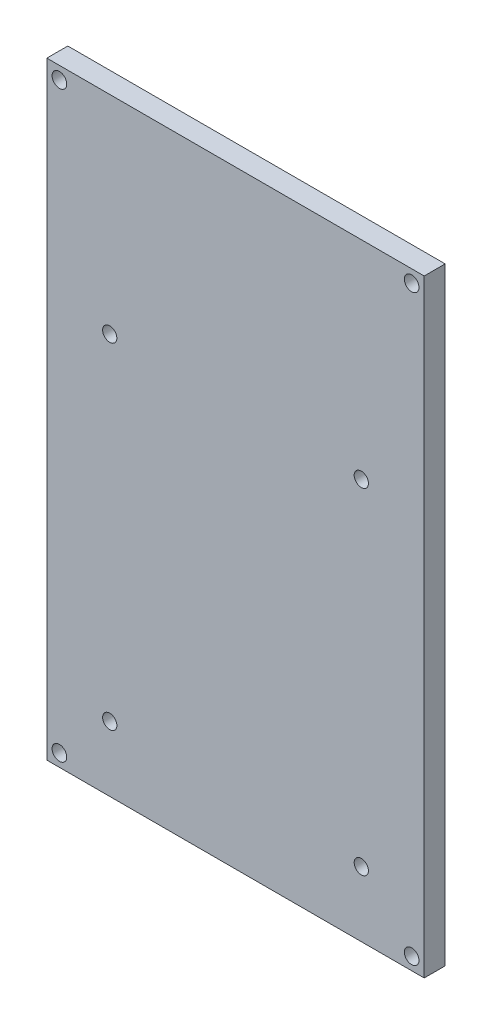
ISO-10303-21;
HEADER;
FILE_DESCRIPTION(('STEP AP214'),'2;1');
FILE_NAME('part.step','',(''),(''),'','','');
FILE_SCHEMA(('AUTOMOTIVE_DESIGN { 1 0 10303 214 1 1 1 1 }'));
ENDSEC;
DATA;
#1=APPLICATION_CONTEXT('core data for automotive mechanical design processes');
#2=APPLICATION_PROTOCOL_DEFINITION('international standard','automotive_design',2000,#1);
#3=PRODUCT_CONTEXT('',#1,'mechanical');
#4=PRODUCT('Part','Part','',(#3));
#5=PRODUCT_RELATED_PRODUCT_CATEGORY('part','',(#4));
#6=PRODUCT_DEFINITION_FORMATION('','',#4);
#7=PRODUCT_DEFINITION_CONTEXT('part definition',#1,'design');
#8=PRODUCT_DEFINITION('design','',#6,#7);
#9=PRODUCT_DEFINITION_SHAPE('','',#8);
#10=(LENGTH_UNIT() NAMED_UNIT(*) SI_UNIT(.MILLI.,.METRE.));
#11=(NAMED_UNIT(*) PLANE_ANGLE_UNIT() SI_UNIT($,.RADIAN.));
#12=(NAMED_UNIT(*) SI_UNIT($,.STERADIAN.) SOLID_ANGLE_UNIT());
#13=UNCERTAINTY_MEASURE_WITH_UNIT(LENGTH_MEASURE(1.E-05),#10,'distance_accuracy_value','');
#14=(GEOMETRIC_REPRESENTATION_CONTEXT(3) GLOBAL_UNCERTAINTY_ASSIGNED_CONTEXT((#13)) GLOBAL_UNIT_ASSIGNED_CONTEXT((#10,
#11,#12)) REPRESENTATION_CONTEXT('',''));
#15=CARTESIAN_POINT('',(0.,0.,0.));
#16=DIRECTION('',(0.,0.,1.));
#17=DIRECTION('',(1.,0.,0.));
#18=AXIS2_PLACEMENT_3D('',#15,#16,#17);
#19=CARTESIAN_POINT('',(45.,-72.5,5.));
#20=DIRECTION('',(-1.,0.,0.));
#21=DIRECTION('',(0.,0.,1.));
#22=AXIS2_PLACEMENT_3D('',#19,#20,#21);
#23=PLANE('',#22);
#24=DIRECTION('',(0.,1.,0.));
#25=VECTOR('',#24,1.);
#26=CARTESIAN_POINT('',(45.,-72.5,0.));
#27=LINE('',#26,#25);
#28=CARTESIAN_POINT('',(45.,-72.5,0.));
#29=VERTEX_POINT('',#28);
#30=CARTESIAN_POINT('',(45.,72.5,0.));
#31=VERTEX_POINT('',#30);
#32=EDGE_CURVE('E106',#29,#31,#27,.T.);
#33=ORIENTED_EDGE('',*,*,#32,.T.);
#34=DIRECTION('',(0.,0.,-1.));
#35=VECTOR('',#34,1.);
#36=CARTESIAN_POINT('',(45.,72.5,5.));
#37=LINE('',#36,#35);
#38=CARTESIAN_POINT('',(45.,72.5,5.));
#39=VERTEX_POINT('',#38);
#40=EDGE_CURVE('E11',#39,#31,#37,.T.);
#41=ORIENTED_EDGE('',*,*,#40,.F.);
#42=DIRECTION('',(0.,1.,0.));
#43=VECTOR('',#42,1.);
#44=CARTESIAN_POINT('',(45.,-72.5,5.));
#45=LINE('',#44,#43);
#46=CARTESIAN_POINT('',(45.,-72.5,5.));
#47=VERTEX_POINT('',#46);
#48=EDGE_CURVE('E90',#47,#39,#45,.T.);
#49=ORIENTED_EDGE('',*,*,#48,.F.);
#50=DIRECTION('',(0.,0.,-1.));
#51=VECTOR('',#50,1.);
#52=CARTESIAN_POINT('',(45.,-72.5,5.));
#53=LINE('',#52,#51);
#54=EDGE_CURVE('E102',#47,#29,#53,.T.);
#55=ORIENTED_EDGE('',*,*,#54,.T.);
#56=EDGE_LOOP('',(#33,#41,#49,#55));
#57=FACE_BOUND('',#56,.T.);
#58=ADVANCED_FACE('F38',(#57),#23,.F.);
#59=CARTESIAN_POINT('',(-45.,72.5,5.));
#60=DIRECTION('',(0.,-1.,0.));
#61=DIRECTION('',(0.,0.,-1.));
#62=AXIS2_PLACEMENT_3D('',#59,#60,#61);
#63=PLANE('',#62);
#64=DIRECTION('',(-1.,0.,0.));
#65=VECTOR('',#64,1.);
#66=CARTESIAN_POINT('',(-45.,72.5,0.));
#67=LINE('',#66,#65);
#68=CARTESIAN_POINT('',(-45.,72.5,0.));
#69=VERTEX_POINT('',#68);
#70=EDGE_CURVE('E95',#31,#69,#67,.T.);
#71=ORIENTED_EDGE('',*,*,#70,.T.);
#72=DIRECTION('',(0.,0.,-1.));
#73=VECTOR('',#72,1.);
#74=CARTESIAN_POINT('',(-45.,72.5,5.));
#75=LINE('',#74,#73);
#76=CARTESIAN_POINT('',(-45.,72.5,5.));
#77=VERTEX_POINT('',#76);
#78=EDGE_CURVE('E47',#77,#69,#75,.T.);
#79=ORIENTED_EDGE('',*,*,#78,.F.);
#80=DIRECTION('',(-1.,0.,0.));
#81=VECTOR('',#80,1.);
#82=CARTESIAN_POINT('',(-45.,72.5,5.));
#83=LINE('',#82,#81);
#84=EDGE_CURVE('E85',#39,#77,#83,.T.);
#85=ORIENTED_EDGE('',*,*,#84,.F.);
#86=ORIENTED_EDGE('',*,*,#40,.T.);
#87=EDGE_LOOP('',(#71,#79,#85,#86));
#88=FACE_BOUND('',#87,.T.);
#89=ADVANCED_FACE('F94',(#88),#63,.F.);
#90=CARTESIAN_POINT('',(-45.,-72.5,5.));
#91=DIRECTION('',(1.,0.,0.));
#92=DIRECTION('',(0.,0.,-1.));
#93=AXIS2_PLACEMENT_3D('',#90,#91,#92);
#94=PLANE('',#93);
#95=DIRECTION('',(0.,-1.,0.));
#96=VECTOR('',#95,1.);
#97=CARTESIAN_POINT('',(-45.,-72.5,0.));
#98=LINE('',#97,#96);
#99=CARTESIAN_POINT('',(-45.,-72.5,0.));
#100=VERTEX_POINT('',#99);
#101=EDGE_CURVE('E72',#69,#100,#98,.T.);
#102=ORIENTED_EDGE('',*,*,#101,.T.);
#103=DIRECTION('',(0.,0.,-1.));
#104=VECTOR('',#103,1.);
#105=CARTESIAN_POINT('',(-45.,-72.5,5.));
#106=LINE('',#105,#104);
#107=CARTESIAN_POINT('',(-45.,-72.5,5.));
#108=VERTEX_POINT('',#107);
#109=EDGE_CURVE('E97',#108,#100,#106,.T.);
#110=ORIENTED_EDGE('',*,*,#109,.F.);
#111=DIRECTION('',(0.,-1.,0.));
#112=VECTOR('',#111,1.);
#113=CARTESIAN_POINT('',(-45.,-72.5,5.));
#114=LINE('',#113,#112);
#115=EDGE_CURVE('E88',#77,#108,#114,.T.);
#116=ORIENTED_EDGE('',*,*,#115,.F.);
#117=ORIENTED_EDGE('',*,*,#78,.T.);
#118=EDGE_LOOP('',(#102,#110,#116,#117));
#119=FACE_BOUND('',#118,.T.);
#120=ADVANCED_FACE('F98',(#119),#94,.F.);
#121=CARTESIAN_POINT('',(-45.,-72.5,5.));
#122=DIRECTION('',(0.,1.,0.));
#123=DIRECTION('',(0.,0.,1.));
#124=AXIS2_PLACEMENT_3D('',#121,#122,#123);
#125=PLANE('',#124);
#126=DIRECTION('',(1.,0.,0.));
#127=VECTOR('',#126,1.);
#128=CARTESIAN_POINT('',(-45.,-72.5,0.));
#129=LINE('',#128,#127);
#130=EDGE_CURVE('E78',#100,#29,#129,.T.);
#131=ORIENTED_EDGE('',*,*,#130,.T.);
#132=ORIENTED_EDGE('',*,*,#54,.F.);
#133=DIRECTION('',(1.,0.,0.));
#134=VECTOR('',#133,1.);
#135=CARTESIAN_POINT('',(-45.,-72.5,5.));
#136=LINE('',#135,#134);
#137=EDGE_CURVE('E55',#108,#47,#136,.T.);
#138=ORIENTED_EDGE('',*,*,#137,.F.);
#139=ORIENTED_EDGE('',*,*,#109,.T.);
#140=EDGE_LOOP('',(#131,#132,#138,#139));
#141=FACE_BOUND('',#140,.T.);
#142=ADVANCED_FACE('F120',(#141),#125,.F.);
#143=CARTESIAN_POINT('',(0.,0.,5.));
#144=DIRECTION('',(0.,0.,-1.));
#145=DIRECTION('',(-1.,0.,0.));
#146=AXIS2_PLACEMENT_3D('',#143,#144,#145);
#147=PLANE('',#146);
#148=CARTESIAN_POINT('',(30.0000000000001,-56.9999999999999,5.));
#149=DIRECTION('',(0.,0.,-1.));
#150=DIRECTION('',(1.,0.,0.));
#151=AXIS2_PLACEMENT_3D('',#148,#149,#150);
#152=CIRCLE('',#151,1.7);
#153=CARTESIAN_POINT('',(31.7000000000001,-56.9999999999999,5.));
#154=VERTEX_POINT('',#153);
#155=EDGE_CURVE('E171',#154,#154,#152,.T.);
#156=ORIENTED_EDGE('',*,*,#155,.T.);
#157=EDGE_LOOP('',(#156));
#158=FACE_BOUND('',#157,.T.);
#159=CARTESIAN_POINT('',(-29.9999999999999,-57.,5.));
#160=DIRECTION('',(0.,0.,-1.));
#161=DIRECTION('',(-1.,0.,0.));
#162=AXIS2_PLACEMENT_3D('',#159,#160,#161);
#163=CIRCLE('',#162,1.7);
#164=CARTESIAN_POINT('',(-31.6999999999999,-57.,5.));
#165=VERTEX_POINT('',#164);
#166=EDGE_CURVE('E179',#165,#165,#163,.T.);
#167=ORIENTED_EDGE('',*,*,#166,.T.);
#168=EDGE_LOOP('',(#167));
#169=FACE_BOUND('',#168,.T.);
#170=CARTESIAN_POINT('',(-30.,23.,5.));
#171=DIRECTION('',(0.,0.,-1.));
#172=DIRECTION('',(1.,0.,0.));
#173=AXIS2_PLACEMENT_3D('',#170,#171,#172);
#174=CIRCLE('',#173,1.7);
#175=CARTESIAN_POINT('',(-28.3,23.,5.));
#176=VERTEX_POINT('',#175);
#177=EDGE_CURVE('E163',#176,#176,#174,.T.);
#178=ORIENTED_EDGE('',*,*,#177,.T.);
#179=EDGE_LOOP('',(#178));
#180=FACE_BOUND('',#179,.T.);
#181=CARTESIAN_POINT('',(30.,23.,5.));
#182=DIRECTION('',(0.,0.,-1.));
#183=DIRECTION('',(-1.,0.,0.));
#184=AXIS2_PLACEMENT_3D('',#181,#182,#183);
#185=CIRCLE('',#184,1.7);
#186=CARTESIAN_POINT('',(28.3,23.,5.));
#187=VERTEX_POINT('',#186);
#188=EDGE_CURVE('E155',#187,#187,#185,.T.);
#189=ORIENTED_EDGE('',*,*,#188,.T.);
#190=EDGE_LOOP('',(#189));
#191=FACE_BOUND('',#190,.T.);
#192=CARTESIAN_POINT('',(42.,-69.5,5.));
#193=DIRECTION('',(0.,0.,-1.));
#194=DIRECTION('',(1.,0.,0.));
#195=AXIS2_PLACEMENT_3D('',#192,#193,#194);
#196=CIRCLE('',#195,1.75);
#197=CARTESIAN_POINT('',(43.75,-69.5,5.));
#198=VERTEX_POINT('',#197);
#199=EDGE_CURVE('E131',#198,#198,#196,.T.);
#200=ORIENTED_EDGE('',*,*,#199,.T.);
#201=EDGE_LOOP('',(#200));
#202=FACE_BOUND('',#201,.T.);
#203=CARTESIAN_POINT('',(-42.,69.5,5.));
#204=DIRECTION('',(0.,0.,-1.));
#205=DIRECTION('',(1.,0.,0.));
#206=AXIS2_PLACEMENT_3D('',#203,#204,#205);
#207=CIRCLE('',#206,1.75);
#208=CARTESIAN_POINT('',(-40.2499999999999,69.5,5.));
#209=VERTEX_POINT('',#208);
#210=EDGE_CURVE('E139',#209,#209,#207,.T.);
#211=ORIENTED_EDGE('',*,*,#210,.T.);
#212=EDGE_LOOP('',(#211));
#213=FACE_BOUND('',#212,.T.);
#214=CARTESIAN_POINT('',(-42.,-69.5,5.));
#215=DIRECTION('',(0.,0.,-1.));
#216=DIRECTION('',(-1.,0.,0.));
#217=AXIS2_PLACEMENT_3D('',#214,#215,#216);
#218=CIRCLE('',#217,1.75);
#219=CARTESIAN_POINT('',(-43.75,-69.5,5.));
#220=VERTEX_POINT('',#219);
#221=EDGE_CURVE('E140',#220,#220,#218,.T.);
#222=ORIENTED_EDGE('',*,*,#221,.T.);
#223=EDGE_LOOP('',(#222));
#224=FACE_BOUND('',#223,.T.);
#225=CARTESIAN_POINT('',(42.,69.5,5.));
#226=DIRECTION('',(0.,0.,-1.));
#227=DIRECTION('',(-1.,0.,0.));
#228=AXIS2_PLACEMENT_3D('',#225,#226,#227);
#229=CIRCLE('',#228,1.75);
#230=CARTESIAN_POINT('',(40.25,69.5,5.));
#231=VERTEX_POINT('',#230);
#232=EDGE_CURVE('E110',#231,#231,#229,.T.);
#233=ORIENTED_EDGE('',*,*,#232,.T.);
#234=EDGE_LOOP('',(#233));
#235=FACE_BOUND('',#234,.T.);
#236=ORIENTED_EDGE('',*,*,#48,.T.);
#237=ORIENTED_EDGE('',*,*,#84,.T.);
#238=ORIENTED_EDGE('',*,*,#115,.T.);
#239=ORIENTED_EDGE('',*,*,#137,.T.);
#240=EDGE_LOOP('',(#236,#237,#238,#239));
#241=FACE_BOUND('',#240,.T.);
#242=ADVANCED_FACE('F86',(#158,#169,#180,#191,#202,#213,#224,#235,#241),#147,.F.);
#243=CARTESIAN_POINT('',(0.,0.,0.));
#244=DIRECTION('',(0.,0.,-1.));
#245=DIRECTION('',(-1.,0.,0.));
#246=AXIS2_PLACEMENT_3D('',#243,#244,#245);
#247=PLANE('',#246);
#248=CARTESIAN_POINT('',(30.0000000000001,-56.9999999999999,0.));
#249=DIRECTION('',(0.,0.,-1.));
#250=DIRECTION('',(1.,0.,0.));
#251=AXIS2_PLACEMENT_3D('',#248,#249,#250);
#252=CIRCLE('',#251,1.7);
#253=CARTESIAN_POINT('',(31.7000000000001,-56.9999999999999,0.));
#254=VERTEX_POINT('',#253);
#255=EDGE_CURVE('E167',#254,#254,#252,.T.);
#256=ORIENTED_EDGE('',*,*,#255,.F.);
#257=EDGE_LOOP('',(#256));
#258=FACE_BOUND('',#257,.T.);
#259=CARTESIAN_POINT('',(-29.9999999999999,-57.,0.));
#260=DIRECTION('',(0.,0.,-1.));
#261=DIRECTION('',(-1.,0.,0.));
#262=AXIS2_PLACEMENT_3D('',#259,#260,#261);
#263=CIRCLE('',#262,1.7);
#264=CARTESIAN_POINT('',(-31.6999999999999,-57.,0.));
#265=VERTEX_POINT('',#264);
#266=EDGE_CURVE('E175',#265,#265,#263,.T.);
#267=ORIENTED_EDGE('',*,*,#266,.F.);
#268=EDGE_LOOP('',(#267));
#269=FACE_BOUND('',#268,.T.);
#270=CARTESIAN_POINT('',(-30.,23.,0.));
#271=DIRECTION('',(0.,0.,-1.));
#272=DIRECTION('',(1.,0.,0.));
#273=AXIS2_PLACEMENT_3D('',#270,#271,#272);
#274=CIRCLE('',#273,1.7);
#275=CARTESIAN_POINT('',(-28.3,23.,0.));
#276=VERTEX_POINT('',#275);
#277=EDGE_CURVE('E183',#276,#276,#274,.T.);
#278=ORIENTED_EDGE('',*,*,#277,.F.);
#279=EDGE_LOOP('',(#278));
#280=FACE_BOUND('',#279,.T.);
#281=CARTESIAN_POINT('',(30.,23.,0.));
#282=DIRECTION('',(0.,0.,-1.));
#283=DIRECTION('',(-1.,0.,0.));
#284=AXIS2_PLACEMENT_3D('',#281,#282,#283);
#285=CIRCLE('',#284,1.7);
#286=CARTESIAN_POINT('',(28.3,23.,0.));
#287=VERTEX_POINT('',#286);
#288=EDGE_CURVE('E159',#287,#287,#285,.T.);
#289=ORIENTED_EDGE('',*,*,#288,.F.);
#290=EDGE_LOOP('',(#289));
#291=FACE_BOUND('',#290,.T.);
#292=CARTESIAN_POINT('',(42.,-69.5,0.));
#293=DIRECTION('',(0.,0.,-1.));
#294=DIRECTION('',(1.,0.,0.));
#295=AXIS2_PLACEMENT_3D('',#292,#293,#294);
#296=CIRCLE('',#295,1.75);
#297=CARTESIAN_POINT('',(43.75,-69.5,0.));
#298=VERTEX_POINT('',#297);
#299=EDGE_CURVE('E144',#298,#298,#296,.T.);
#300=ORIENTED_EDGE('',*,*,#299,.F.);
#301=EDGE_LOOP('',(#300));
#302=FACE_BOUND('',#301,.T.);
#303=CARTESIAN_POINT('',(-42.,69.5,0.));
#304=DIRECTION('',(0.,0.,-1.));
#305=DIRECTION('',(1.,0.,0.));
#306=AXIS2_PLACEMENT_3D('',#303,#304,#305);
#307=CIRCLE('',#306,1.75);
#308=CARTESIAN_POINT('',(-40.2499999999999,69.5,0.));
#309=VERTEX_POINT('',#308);
#310=EDGE_CURVE('E135',#309,#309,#307,.T.);
#311=ORIENTED_EDGE('',*,*,#310,.F.);
#312=EDGE_LOOP('',(#311));
#313=FACE_BOUND('',#312,.T.);
#314=CARTESIAN_POINT('',(-42.,-69.5,0.));
#315=DIRECTION('',(0.,0.,-1.));
#316=DIRECTION('',(-1.,0.,0.));
#317=AXIS2_PLACEMENT_3D('',#314,#315,#316);
#318=CIRCLE('',#317,1.75);
#319=CARTESIAN_POINT('',(-43.75,-69.5,0.));
#320=VERTEX_POINT('',#319);
#321=EDGE_CURVE('E151',#320,#320,#318,.T.);
#322=ORIENTED_EDGE('',*,*,#321,.F.);
#323=EDGE_LOOP('',(#322));
#324=FACE_BOUND('',#323,.T.);
#325=CARTESIAN_POINT('',(42.,69.5,0.));
#326=DIRECTION('',(0.,0.,-1.));
#327=DIRECTION('',(-1.,0.,0.));
#328=AXIS2_PLACEMENT_3D('',#325,#326,#327);
#329=CIRCLE('',#328,1.75);
#330=CARTESIAN_POINT('',(40.25,69.5,0.));
#331=VERTEX_POINT('',#330);
#332=EDGE_CURVE('E127',#331,#331,#329,.T.);
#333=ORIENTED_EDGE('',*,*,#332,.F.);
#334=EDGE_LOOP('',(#333));
#335=FACE_BOUND('',#334,.T.);
#336=ORIENTED_EDGE('',*,*,#32,.F.);
#337=ORIENTED_EDGE('',*,*,#130,.F.);
#338=ORIENTED_EDGE('',*,*,#101,.F.);
#339=ORIENTED_EDGE('',*,*,#70,.F.);
#340=EDGE_LOOP('',(#336,#337,#338,#339));
#341=FACE_BOUND('',#340,.T.);
#342=ADVANCED_FACE('F123',(#258,#269,#280,#291,#302,#313,#324,#335,#341),#247,.T.);
#343=CARTESIAN_POINT('',(42.,69.5,5.));
#344=DIRECTION('',(0.,0.,-1.));
#345=DIRECTION('',(-1.,0.,0.));
#346=AXIS2_PLACEMENT_3D('',#343,#344,#345);
#347=CYLINDRICAL_SURFACE('',#346,1.75);
#348=ORIENTED_EDGE('',*,*,#232,.F.);
#349=EDGE_LOOP('',(#348));
#350=FACE_BOUND('',#349,.T.);
#351=ORIENTED_EDGE('',*,*,#332,.T.);
#352=EDGE_LOOP('',(#351));
#353=FACE_BOUND('',#352,.T.);
#354=ADVANCED_FACE('F203',(#350,#353),#347,.F.);
#355=CARTESIAN_POINT('',(-42.,-69.5,5.));
#356=DIRECTION('',(0.,0.,-1.));
#357=DIRECTION('',(-1.,0.,0.));
#358=AXIS2_PLACEMENT_3D('',#355,#356,#357);
#359=CYLINDRICAL_SURFACE('',#358,1.75);
#360=ORIENTED_EDGE('',*,*,#221,.F.);
#361=EDGE_LOOP('',(#360));
#362=FACE_BOUND('',#361,.T.);
#363=ORIENTED_EDGE('',*,*,#321,.T.);
#364=EDGE_LOOP('',(#363));
#365=FACE_BOUND('',#364,.T.);
#366=ADVANCED_FACE('F217',(#362,#365),#359,.F.);
#367=CARTESIAN_POINT('',(-42.,69.5,5.));
#368=DIRECTION('',(0.,0.,-1.));
#369=DIRECTION('',(-1.,0.,0.));
#370=AXIS2_PLACEMENT_3D('',#367,#368,#369);
#371=CYLINDRICAL_SURFACE('',#370,1.75);
#372=ORIENTED_EDGE('',*,*,#210,.F.);
#373=EDGE_LOOP('',(#372));
#374=FACE_BOUND('',#373,.T.);
#375=ORIENTED_EDGE('',*,*,#310,.T.);
#376=EDGE_LOOP('',(#375));
#377=FACE_BOUND('',#376,.T.);
#378=ADVANCED_FACE('F224',(#374,#377),#371,.F.);
#379=CARTESIAN_POINT('',(42.,-69.5,5.));
#380=DIRECTION('',(0.,0.,-1.));
#381=DIRECTION('',(-1.,0.,0.));
#382=AXIS2_PLACEMENT_3D('',#379,#380,#381);
#383=CYLINDRICAL_SURFACE('',#382,1.75);
#384=ORIENTED_EDGE('',*,*,#199,.F.);
#385=EDGE_LOOP('',(#384));
#386=FACE_BOUND('',#385,.T.);
#387=ORIENTED_EDGE('',*,*,#299,.T.);
#388=EDGE_LOOP('',(#387));
#389=FACE_BOUND('',#388,.T.);
#390=ADVANCED_FACE('F262',(#386,#389),#383,.F.);
#391=CARTESIAN_POINT('',(30.,23.,5.));
#392=DIRECTION('',(0.,0.,-1.));
#393=DIRECTION('',(-1.,0.,0.));
#394=AXIS2_PLACEMENT_3D('',#391,#392,#393);
#395=CYLINDRICAL_SURFACE('',#394,1.7);
#396=ORIENTED_EDGE('',*,*,#188,.F.);
#397=EDGE_LOOP('',(#396));
#398=FACE_BOUND('',#397,.T.);
#399=ORIENTED_EDGE('',*,*,#288,.T.);
#400=EDGE_LOOP('',(#399));
#401=FACE_BOUND('',#400,.T.);
#402=ADVANCED_FACE('F197',(#398,#401),#395,.F.);
#403=CARTESIAN_POINT('',(-30.,23.,5.));
#404=DIRECTION('',(0.,0.,-1.));
#405=DIRECTION('',(-1.,0.,0.));
#406=AXIS2_PLACEMENT_3D('',#403,#404,#405);
#407=CYLINDRICAL_SURFACE('',#406,1.7);
#408=ORIENTED_EDGE('',*,*,#177,.F.);
#409=EDGE_LOOP('',(#408));
#410=FACE_BOUND('',#409,.T.);
#411=ORIENTED_EDGE('',*,*,#277,.T.);
#412=EDGE_LOOP('',(#411));
#413=FACE_BOUND('',#412,.T.);
#414=ADVANCED_FACE('F193',(#410,#413),#407,.F.);
#415=CARTESIAN_POINT('',(-29.9999999999999,-57.,5.));
#416=DIRECTION('',(0.,0.,-1.));
#417=DIRECTION('',(-1.,0.,0.));
#418=AXIS2_PLACEMENT_3D('',#415,#416,#417);
#419=CYLINDRICAL_SURFACE('',#418,1.7);
#420=ORIENTED_EDGE('',*,*,#166,.F.);
#421=EDGE_LOOP('',(#420));
#422=FACE_BOUND('',#421,.T.);
#423=ORIENTED_EDGE('',*,*,#266,.T.);
#424=EDGE_LOOP('',(#423));
#425=FACE_BOUND('',#424,.T.);
#426=ADVANCED_FACE('F196',(#422,#425),#419,.F.);
#427=CARTESIAN_POINT('',(30.0000000000001,-56.9999999999999,5.));
#428=DIRECTION('',(0.,0.,-1.));
#429=DIRECTION('',(-1.,0.,0.));
#430=AXIS2_PLACEMENT_3D('',#427,#428,#429);
#431=CYLINDRICAL_SURFACE('',#430,1.7);
#432=ORIENTED_EDGE('',*,*,#155,.F.);
#433=EDGE_LOOP('',(#432));
#434=FACE_BOUND('',#433,.T.);
#435=ORIENTED_EDGE('',*,*,#255,.T.);
#436=EDGE_LOOP('',(#435));
#437=FACE_BOUND('',#436,.T.);
#438=ADVANCED_FACE('F251',(#434,#437),#431,.F.);
#439=CLOSED_SHELL('',(#58,#89,#120,#142,#242,#342,#354,#366,#378,#390,#402,#414,#426,#438));
#440=MANIFOLD_SOLID_BREP('B2',#439);
#441=ADVANCED_BREP_SHAPE_REPRESENTATION('',(#18,#440),#14);
#442=SHAPE_DEFINITION_REPRESENTATION(#9,#441);
ENDSEC;
END-ISO-10303-21;
